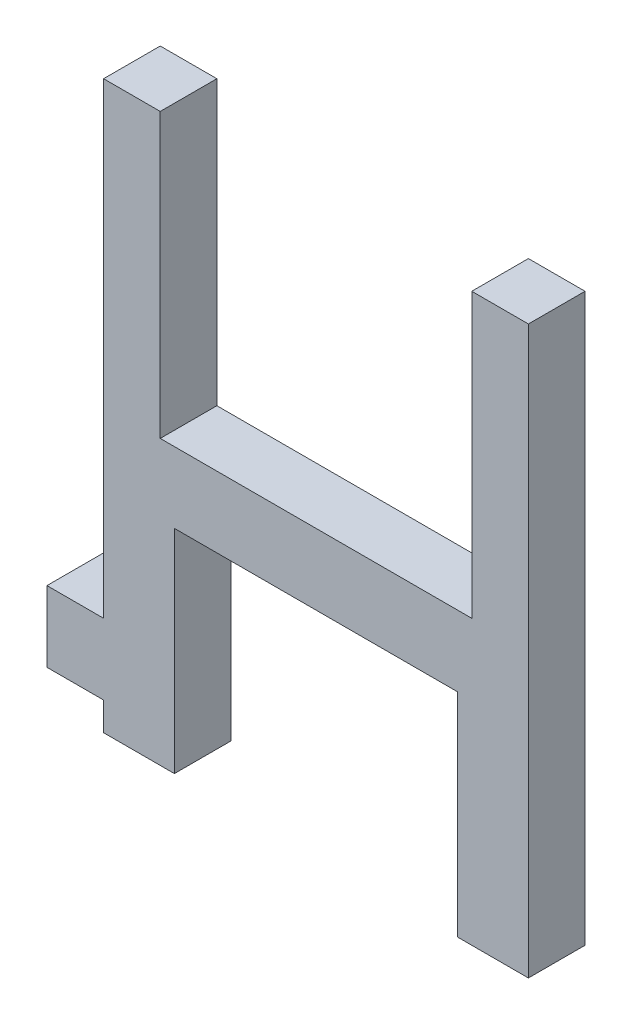
ISO-10303-21;
HEADER;
FILE_DESCRIPTION(('STEP AP214'),'2;1');
FILE_NAME('part.step','',(''),(''),'','','');
FILE_SCHEMA(('AUTOMOTIVE_DESIGN { 1 0 10303 214 1 1 1 1 }'));
ENDSEC;
DATA;
#1=APPLICATION_CONTEXT('core data for automotive mechanical design processes');
#2=APPLICATION_PROTOCOL_DEFINITION('international standard','automotive_design',2000,#1);
#3=PRODUCT_CONTEXT('',#1,'mechanical');
#4=PRODUCT('Part','Part','',(#3));
#5=PRODUCT_RELATED_PRODUCT_CATEGORY('part','',(#4));
#6=PRODUCT_DEFINITION_FORMATION('','',#4);
#7=PRODUCT_DEFINITION_CONTEXT('part definition',#1,'design');
#8=PRODUCT_DEFINITION('design','',#6,#7);
#9=PRODUCT_DEFINITION_SHAPE('','',#8);
#10=(LENGTH_UNIT() NAMED_UNIT(*) SI_UNIT(.MILLI.,.METRE.));
#11=(NAMED_UNIT(*) PLANE_ANGLE_UNIT() SI_UNIT($,.RADIAN.));
#12=(NAMED_UNIT(*) SI_UNIT($,.STERADIAN.) SOLID_ANGLE_UNIT());
#13=UNCERTAINTY_MEASURE_WITH_UNIT(LENGTH_MEASURE(1.E-05),#10,'distance_accuracy_value','');
#14=(GEOMETRIC_REPRESENTATION_CONTEXT(3) GLOBAL_UNCERTAINTY_ASSIGNED_CONTEXT((#13)) GLOBAL_UNIT_ASSIGNED_CONTEXT((#10,
#11,#12)) REPRESENTATION_CONTEXT('',''));
#15=CARTESIAN_POINT('',(0.,0.,0.));
#16=DIRECTION('',(0.,0.,1.));
#17=DIRECTION('',(1.,0.,0.));
#18=AXIS2_PLACEMENT_3D('',#15,#16,#17);
#19=CARTESIAN_POINT('',(35.,18.,4.));
#20=DIRECTION('',(0.,-1.,0.));
#21=DIRECTION('',(1.,0.,0.));
#22=AXIS2_PLACEMENT_3D('',#19,#20,#21);
#23=PLANE('',#22);
#24=DIRECTION('',(0.,0.,1.));
#25=VECTOR('',#24,1.);
#26=CARTESIAN_POINT('',(31.,18.,0.));
#27=LINE('',#26,#25);
#28=CARTESIAN_POINT('',(31.,18.,0.));
#29=VERTEX_POINT('',#28);
#30=CARTESIAN_POINT('',(31.,18.,4.));
#31=VERTEX_POINT('',#30);
#32=EDGE_CURVE('E320',#29,#31,#27,.T.);
#33=ORIENTED_EDGE('',*,*,#32,.F.);
#34=DIRECTION('',(-1.,0.,0.));
#35=VECTOR('',#34,1.);
#36=CARTESIAN_POINT('',(35.,18.,0.));
#37=LINE('',#36,#35);
#38=CARTESIAN_POINT('',(9.,18.,0.));
#39=VERTEX_POINT('',#38);
#40=EDGE_CURVE('E236',#29,#39,#37,.T.);
#41=ORIENTED_EDGE('',*,*,#40,.T.);
#42=DIRECTION('',(0.,0.,-1.));
#43=VECTOR('',#42,1.);
#44=CARTESIAN_POINT('',(9.,18.,0.));
#45=LINE('',#44,#43);
#46=CARTESIAN_POINT('',(9.,18.,4.));
#47=VERTEX_POINT('',#46);
#48=EDGE_CURVE('E336',#47,#39,#45,.T.);
#49=ORIENTED_EDGE('',*,*,#48,.F.);
#50=DIRECTION('',(-1.,0.,0.));
#51=VECTOR('',#50,1.);
#52=CARTESIAN_POINT('',(35.,18.,4.));
#53=LINE('',#52,#51);
#54=EDGE_CURVE('E62',#31,#47,#53,.T.);
#55=ORIENTED_EDGE('',*,*,#54,.F.);
#56=EDGE_LOOP('',(#33,#41,#49,#55));
#57=FACE_BOUND('',#56,.T.);
#58=ADVANCED_FACE('F39',(#57),#23,.F.);
#59=CARTESIAN_POINT('',(0.,0.,4.));
#60=DIRECTION('',(0.,1.,0.));
#61=DIRECTION('',(-1.,0.,0.));
#62=AXIS2_PLACEMENT_3D('',#59,#60,#61);
#63=PLANE('',#62);
#64=DIRECTION('',(1.,0.,0.));
#65=VECTOR('',#64,1.);
#66=CARTESIAN_POINT('',(0.,0.,4.));
#67=LINE('',#66,#65);
#68=CARTESIAN_POINT('',(1.,0.,4.));
#69=VERTEX_POINT('',#68);
#70=CARTESIAN_POINT('',(5.,0.,4.));
#71=VERTEX_POINT('',#70);
#72=EDGE_CURVE('E163',#69,#71,#67,.T.);
#73=ORIENTED_EDGE('',*,*,#72,.F.);
#74=DIRECTION('',(0.,0.,1.));
#75=VECTOR('',#74,1.);
#76=CARTESIAN_POINT('',(1.,0.,-6.));
#77=LINE('',#76,#75);
#78=CARTESIAN_POINT('',(1.,0.,0.));
#79=VERTEX_POINT('',#78);
#80=EDGE_CURVE('E151',#79,#69,#77,.T.);
#81=ORIENTED_EDGE('',*,*,#80,.F.);
#82=DIRECTION('',(1.,0.,0.));
#83=VECTOR('',#82,1.);
#84=CARTESIAN_POINT('',(0.,0.,0.));
#85=LINE('',#84,#83);
#86=CARTESIAN_POINT('',(5.,0.,0.));
#87=VERTEX_POINT('',#86);
#88=EDGE_CURVE('E211',#79,#87,#85,.T.);
#89=ORIENTED_EDGE('',*,*,#88,.T.);
#90=DIRECTION('',(0.,0.,-1.));
#91=VECTOR('',#90,1.);
#92=CARTESIAN_POINT('',(5.,0.,4.));
#93=LINE('',#92,#91);
#94=EDGE_CURVE('E48',#71,#87,#93,.T.);
#95=ORIENTED_EDGE('',*,*,#94,.F.);
#96=EDGE_LOOP('',(#73,#81,#89,#95));
#97=FACE_BOUND('',#96,.T.);
#98=ADVANCED_FACE('F41',(#97),#63,.F.);
#99=CARTESIAN_POINT('',(5.,0.,4.));
#100=DIRECTION('',(1.,0.,0.));
#101=DIRECTION('',(0.,0.,-1.));
#102=AXIS2_PLACEMENT_3D('',#99,#100,#101);
#103=PLANE('',#102);
#104=DIRECTION('',(0.,-1.,0.));
#105=VECTOR('',#104,1.);
#106=CARTESIAN_POINT('',(5.,0.,0.));
#107=LINE('',#106,#105);
#108=CARTESIAN_POINT('',(5.,-2.,0.));
#109=VERTEX_POINT('',#108);
#110=EDGE_CURVE('E214',#87,#109,#107,.T.);
#111=ORIENTED_EDGE('',*,*,#110,.T.);
#112=DIRECTION('',(0.,0.,-1.));
#113=VECTOR('',#112,1.);
#114=CARTESIAN_POINT('',(5.,-2.,4.));
#115=LINE('',#114,#113);
#116=CARTESIAN_POINT('',(5.,-2.,4.));
#117=VERTEX_POINT('',#116);
#118=EDGE_CURVE('E264',#117,#109,#115,.T.);
#119=ORIENTED_EDGE('',*,*,#118,.F.);
#120=DIRECTION('',(0.,-1.,0.));
#121=VECTOR('',#120,1.);
#122=CARTESIAN_POINT('',(5.,0.,4.));
#123=LINE('',#122,#121);
#124=EDGE_CURVE('E172',#71,#117,#123,.T.);
#125=ORIENTED_EDGE('',*,*,#124,.F.);
#126=ORIENTED_EDGE('',*,*,#94,.T.);
#127=EDGE_LOOP('',(#111,#119,#125,#126));
#128=FACE_BOUND('',#127,.T.);
#129=ADVANCED_FACE('F270',(#128),#103,.F.);
#130=CARTESIAN_POINT('',(5.,-2.,4.));
#131=DIRECTION('',(0.,1.,0.));
#132=DIRECTION('',(-1.,0.,0.));
#133=AXIS2_PLACEMENT_3D('',#130,#131,#132);
#134=PLANE('',#133);
#135=DIRECTION('',(1.,0.,0.));
#136=VECTOR('',#135,1.);
#137=CARTESIAN_POINT('',(5.,-2.,0.));
#138=LINE('',#137,#136);
#139=CARTESIAN_POINT('',(10.,-2.,0.));
#140=VERTEX_POINT('',#139);
#141=EDGE_CURVE('E217',#109,#140,#138,.T.);
#142=ORIENTED_EDGE('',*,*,#141,.T.);
#143=DIRECTION('',(0.,0.,-1.));
#144=VECTOR('',#143,1.);
#145=CARTESIAN_POINT('',(10.,-2.,4.));
#146=LINE('',#145,#144);
#147=CARTESIAN_POINT('',(10.,-2.,4.));
#148=VERTEX_POINT('',#147);
#149=EDGE_CURVE('E260',#148,#140,#146,.T.);
#150=ORIENTED_EDGE('',*,*,#149,.F.);
#151=DIRECTION('',(1.,0.,0.));
#152=VECTOR('',#151,1.);
#153=CARTESIAN_POINT('',(5.,-2.,4.));
#154=LINE('',#153,#152);
#155=EDGE_CURVE('E177',#117,#148,#154,.T.);
#156=ORIENTED_EDGE('',*,*,#155,.F.);
#157=ORIENTED_EDGE('',*,*,#118,.T.);
#158=EDGE_LOOP('',(#142,#150,#156,#157));
#159=FACE_BOUND('',#158,.T.);
#160=ADVANCED_FACE('F278',(#159),#134,.F.);
#161=CARTESIAN_POINT('',(10.,4.08247422680412,4.));
#162=DIRECTION('',(-1.,0.,0.));
#163=DIRECTION('',(0.,0.,1.));
#164=AXIS2_PLACEMENT_3D('',#161,#162,#163);
#165=PLANE('',#164);
#166=DIRECTION('',(0.,1.,0.));
#167=VECTOR('',#166,1.);
#168=CARTESIAN_POINT('',(10.,4.08247422680412,0.));
#169=LINE('',#168,#167);
#170=CARTESIAN_POINT('',(10.,13.,0.));
#171=VERTEX_POINT('',#170);
#172=EDGE_CURVE('E221',#140,#171,#169,.T.);
#173=ORIENTED_EDGE('',*,*,#172,.T.);
#174=DIRECTION('',(0.,0.,-1.));
#175=VECTOR('',#174,1.);
#176=CARTESIAN_POINT('',(10.,13.,4.));
#177=LINE('',#176,#175);
#178=CARTESIAN_POINT('',(10.,13.,4.));
#179=VERTEX_POINT('',#178);
#180=EDGE_CURVE('E256',#179,#171,#177,.T.);
#181=ORIENTED_EDGE('',*,*,#180,.F.);
#182=DIRECTION('',(0.,1.,0.));
#183=VECTOR('',#182,1.);
#184=CARTESIAN_POINT('',(10.,-2.,4.));
#185=LINE('',#184,#183);
#186=EDGE_CURVE('E188',#148,#179,#185,.T.);
#187=ORIENTED_EDGE('',*,*,#186,.F.);
#188=ORIENTED_EDGE('',*,*,#149,.T.);
#189=EDGE_LOOP('',(#173,#181,#187,#188));
#190=FACE_BOUND('',#189,.T.);
#191=ADVANCED_FACE('F282',(#190),#165,.F.);
#192=CARTESIAN_POINT('',(10.,13.,4.));
#193=DIRECTION('',(0.,1.,0.));
#194=DIRECTION('',(-1.,0.,0.));
#195=AXIS2_PLACEMENT_3D('',#192,#193,#194);
#196=PLANE('',#195);
#197=DIRECTION('',(1.,0.,0.));
#198=VECTOR('',#197,1.);
#199=CARTESIAN_POINT('',(10.,13.,0.));
#200=LINE('',#199,#198);
#201=CARTESIAN_POINT('',(30.,13.,0.));
#202=VERTEX_POINT('',#201);
#203=EDGE_CURVE('E224',#171,#202,#200,.T.);
#204=ORIENTED_EDGE('',*,*,#203,.T.);
#205=DIRECTION('',(0.,0.,-1.));
#206=VECTOR('',#205,1.);
#207=CARTESIAN_POINT('',(30.,13.,4.));
#208=LINE('',#207,#206);
#209=CARTESIAN_POINT('',(30.,13.,4.));
#210=VERTEX_POINT('',#209);
#211=EDGE_CURVE('E252',#210,#202,#208,.T.);
#212=ORIENTED_EDGE('',*,*,#211,.F.);
#213=DIRECTION('',(1.,0.,0.));
#214=VECTOR('',#213,1.);
#215=CARTESIAN_POINT('',(10.,13.,4.));
#216=LINE('',#215,#214);
#217=EDGE_CURVE('E191',#179,#210,#216,.T.);
#218=ORIENTED_EDGE('',*,*,#217,.F.);
#219=ORIENTED_EDGE('',*,*,#180,.T.);
#220=EDGE_LOOP('',(#204,#212,#218,#219));
#221=FACE_BOUND('',#220,.T.);
#222=ADVANCED_FACE('F289',(#221),#196,.F.);
#223=CARTESIAN_POINT('',(30.,13.,4.));
#224=DIRECTION('',(1.,0.,0.));
#225=DIRECTION('',(0.,0.,-1.));
#226=AXIS2_PLACEMENT_3D('',#223,#224,#225);
#227=PLANE('',#226);
#228=DIRECTION('',(0.,-1.,0.));
#229=VECTOR('',#228,1.);
#230=CARTESIAN_POINT('',(30.,13.,0.));
#231=LINE('',#230,#229);
#232=CARTESIAN_POINT('',(30.,-2.,0.));
#233=VERTEX_POINT('',#232);
#234=EDGE_CURVE('E227',#202,#233,#231,.T.);
#235=ORIENTED_EDGE('',*,*,#234,.T.);
#236=DIRECTION('',(0.,0.,-1.));
#237=VECTOR('',#236,1.);
#238=CARTESIAN_POINT('',(30.,-2.,4.));
#239=LINE('',#238,#237);
#240=CARTESIAN_POINT('',(30.,-2.,4.));
#241=VERTEX_POINT('',#240);
#242=EDGE_CURVE('E248',#241,#233,#239,.T.);
#243=ORIENTED_EDGE('',*,*,#242,.F.);
#244=DIRECTION('',(0.,-1.,0.));
#245=VECTOR('',#244,1.);
#246=CARTESIAN_POINT('',(30.,13.,4.));
#247=LINE('',#246,#245);
#248=EDGE_CURVE('E194',#210,#241,#247,.T.);
#249=ORIENTED_EDGE('',*,*,#248,.F.);
#250=ORIENTED_EDGE('',*,*,#211,.T.);
#251=EDGE_LOOP('',(#235,#243,#249,#250));
#252=FACE_BOUND('',#251,.T.);
#253=ADVANCED_FACE('F292',(#252),#227,.F.);
#254=CARTESIAN_POINT('',(30.,-2.,4.));
#255=DIRECTION('',(0.,1.,0.));
#256=DIRECTION('',(0.,0.,1.));
#257=AXIS2_PLACEMENT_3D('',#254,#255,#256);
#258=PLANE('',#257);
#259=DIRECTION('',(1.,0.,0.));
#260=VECTOR('',#259,1.);
#261=CARTESIAN_POINT('',(30.,-2.,0.));
#262=LINE('',#261,#260);
#263=CARTESIAN_POINT('',(35.,-2.,0.));
#264=VERTEX_POINT('',#263);
#265=EDGE_CURVE('E230',#233,#264,#262,.T.);
#266=ORIENTED_EDGE('',*,*,#265,.T.);
#267=DIRECTION('',(0.,0.,-1.));
#268=VECTOR('',#267,1.);
#269=CARTESIAN_POINT('',(35.,-2.,4.));
#270=LINE('',#269,#268);
#271=CARTESIAN_POINT('',(35.,-2.,4.));
#272=VERTEX_POINT('',#271);
#273=EDGE_CURVE('E244',#272,#264,#270,.T.);
#274=ORIENTED_EDGE('',*,*,#273,.F.);
#275=DIRECTION('',(1.,0.,0.));
#276=VECTOR('',#275,1.);
#277=CARTESIAN_POINT('',(30.,-2.,4.));
#278=LINE('',#277,#276);
#279=EDGE_CURVE('E197',#241,#272,#278,.T.);
#280=ORIENTED_EDGE('',*,*,#279,.F.);
#281=ORIENTED_EDGE('',*,*,#242,.T.);
#282=EDGE_LOOP('',(#266,#274,#280,#281));
#283=FACE_BOUND('',#282,.T.);
#284=ADVANCED_FACE('F297',(#283),#258,.F.);
#285=CARTESIAN_POINT('',(35.,-2.,4.));
#286=DIRECTION('',(-1.,0.,0.));
#287=DIRECTION('',(0.,0.,1.));
#288=AXIS2_PLACEMENT_3D('',#285,#286,#287);
#289=PLANE('',#288);
#290=DIRECTION('',(0.,1.,0.));
#291=VECTOR('',#290,1.);
#292=CARTESIAN_POINT('',(35.,-2.,0.));
#293=LINE('',#292,#291);
#294=CARTESIAN_POINT('',(35.,38.,0.));
#295=VERTEX_POINT('',#294);
#296=EDGE_CURVE('E233',#264,#295,#293,.T.);
#297=ORIENTED_EDGE('',*,*,#296,.T.);
#298=DIRECTION('',(0.,0.,-1.));
#299=VECTOR('',#298,1.);
#300=CARTESIAN_POINT('',(35.,38.,0.));
#301=LINE('',#300,#299);
#302=CARTESIAN_POINT('',(35.,38.,4.));
#303=VERTEX_POINT('',#302);
#304=EDGE_CURVE('E308',#303,#295,#301,.T.);
#305=ORIENTED_EDGE('',*,*,#304,.F.);
#306=DIRECTION('',(0.,1.,0.));
#307=VECTOR('',#306,1.);
#308=CARTESIAN_POINT('',(35.,-2.,4.));
#309=LINE('',#308,#307);
#310=EDGE_CURVE('E200',#272,#303,#309,.T.);
#311=ORIENTED_EDGE('',*,*,#310,.F.);
#312=ORIENTED_EDGE('',*,*,#273,.T.);
#313=EDGE_LOOP('',(#297,#305,#311,#312));
#314=FACE_BOUND('',#313,.T.);
#315=ADVANCED_FACE('F315',(#314),#289,.F.);
#316=CARTESIAN_POINT('',(5.,18.,4.));
#317=DIRECTION('',(1.,0.,0.));
#318=DIRECTION('',(0.,1.,0.));
#319=AXIS2_PLACEMENT_3D('',#316,#317,#318);
#320=PLANE('',#319);
#321=DIRECTION('',(0.,-1.,0.));
#322=VECTOR('',#321,1.);
#323=CARTESIAN_POINT('',(5.,18.,0.));
#324=LINE('',#323,#322);
#325=CARTESIAN_POINT('',(4.99999999999999,38.,0.));
#326=VERTEX_POINT('',#325);
#327=CARTESIAN_POINT('',(5.,5.,0.));
#328=VERTEX_POINT('',#327);
#329=EDGE_CURVE('E180',#326,#328,#324,.T.);
#330=ORIENTED_EDGE('',*,*,#329,.T.);
#331=DIRECTION('',(0.,0.,-1.));
#332=VECTOR('',#331,1.);
#333=CARTESIAN_POINT('',(5.,5.,4.));
#334=LINE('',#333,#332);
#335=CARTESIAN_POINT('',(5.,5.,4.));
#336=VERTEX_POINT('',#335);
#337=EDGE_CURVE('E210',#336,#328,#334,.T.);
#338=ORIENTED_EDGE('',*,*,#337,.F.);
#339=DIRECTION('',(0.,-1.,0.));
#340=VECTOR('',#339,1.);
#341=CARTESIAN_POINT('',(5.,18.,4.));
#342=LINE('',#341,#340);
#343=CARTESIAN_POINT('',(5.,38.,4.));
#344=VERTEX_POINT('',#343);
#345=EDGE_CURVE('E205',#344,#336,#342,.T.);
#346=ORIENTED_EDGE('',*,*,#345,.F.);
#347=DIRECTION('',(0.,0.,1.));
#348=VECTOR('',#347,1.);
#349=CARTESIAN_POINT('',(4.99999999999999,38.,0.));
#350=LINE('',#349,#348);
#351=EDGE_CURVE('E337',#326,#344,#350,.T.);
#352=ORIENTED_EDGE('',*,*,#351,.F.);
#353=EDGE_LOOP('',(#330,#338,#346,#352));
#354=FACE_BOUND('',#353,.T.);
#355=ADVANCED_FACE('F386',(#354),#320,.F.);
#356=CARTESIAN_POINT('',(5.,5.,4.));
#357=DIRECTION('',(0.,-1.,0.));
#358=DIRECTION('',(0.,0.,-1.));
#359=AXIS2_PLACEMENT_3D('',#356,#357,#358);
#360=PLANE('',#359);
#361=DIRECTION('',(-1.,0.,0.));
#362=VECTOR('',#361,1.);
#363=CARTESIAN_POINT('',(5.,5.,0.));
#364=LINE('',#363,#362);
#365=CARTESIAN_POINT('',(1.,5.,0.));
#366=VERTEX_POINT('',#365);
#367=EDGE_CURVE('E173',#328,#366,#364,.T.);
#368=ORIENTED_EDGE('',*,*,#367,.T.);
#369=DIRECTION('',(0.,0.,1.));
#370=VECTOR('',#369,1.);
#371=CARTESIAN_POINT('',(1.,5.,-6.));
#372=LINE('',#371,#370);
#373=CARTESIAN_POINT('',(1.,5.,4.));
#374=VERTEX_POINT('',#373);
#375=EDGE_CURVE('E55',#366,#374,#372,.T.);
#376=ORIENTED_EDGE('',*,*,#375,.T.);
#377=DIRECTION('',(-1.,0.,0.));
#378=VECTOR('',#377,1.);
#379=CARTESIAN_POINT('',(5.,5.,4.));
#380=LINE('',#379,#378);
#381=EDGE_CURVE('E166',#336,#374,#380,.T.);
#382=ORIENTED_EDGE('',*,*,#381,.F.);
#383=ORIENTED_EDGE('',*,*,#337,.T.);
#384=EDGE_LOOP('',(#368,#376,#382,#383));
#385=FACE_BOUND('',#384,.T.);
#386=ADVANCED_FACE('F434',(#385),#360,.F.);
#387=CARTESIAN_POINT('',(0.,0.,4.));
#388=DIRECTION('',(0.,0.,1.));
#389=DIRECTION('',(1.,0.,0.));
#390=AXIS2_PLACEMENT_3D('',#387,#388,#389);
#391=PLANE('',#390);
#392=DIRECTION('',(0.,1.,0.));
#393=VECTOR('',#392,1.);
#394=CARTESIAN_POINT('',(1.,5.,4.));
#395=LINE('',#394,#393);
#396=EDGE_CURVE('E154',#69,#374,#395,.T.);
#397=ORIENTED_EDGE('',*,*,#396,.F.);
#398=ORIENTED_EDGE('',*,*,#72,.T.);
#399=ORIENTED_EDGE('',*,*,#124,.T.);
#400=ORIENTED_EDGE('',*,*,#155,.T.);
#401=ORIENTED_EDGE('',*,*,#186,.T.);
#402=ORIENTED_EDGE('',*,*,#217,.T.);
#403=ORIENTED_EDGE('',*,*,#248,.T.);
#404=ORIENTED_EDGE('',*,*,#279,.T.);
#405=ORIENTED_EDGE('',*,*,#310,.T.);
#406=DIRECTION('',(1.,0.,0.));
#407=VECTOR('',#406,1.);
#408=CARTESIAN_POINT('',(35.,38.,4.));
#409=LINE('',#408,#407);
#410=CARTESIAN_POINT('',(31.,38.,4.));
#411=VERTEX_POINT('',#410);
#412=EDGE_CURVE('E302',#411,#303,#409,.T.);
#413=ORIENTED_EDGE('',*,*,#412,.F.);
#414=DIRECTION('',(0.,-1.,0.));
#415=VECTOR('',#414,1.);
#416=CARTESIAN_POINT('',(31.,38.,4.));
#417=LINE('',#416,#415);
#418=EDGE_CURVE('E313',#411,#31,#417,.T.);
#419=ORIENTED_EDGE('',*,*,#418,.T.);
#420=ORIENTED_EDGE('',*,*,#54,.T.);
#421=DIRECTION('',(0.,-1.,0.));
#422=VECTOR('',#421,1.);
#423=CARTESIAN_POINT('',(9.,38.,4.));
#424=LINE('',#423,#422);
#425=CARTESIAN_POINT('',(9.,38.,4.));
#426=VERTEX_POINT('',#425);
#427=EDGE_CURVE('E183',#426,#47,#424,.T.);
#428=ORIENTED_EDGE('',*,*,#427,.F.);
#429=DIRECTION('',(1.,0.,0.));
#430=VECTOR('',#429,1.);
#431=CARTESIAN_POINT('',(5.,38.,4.));
#432=LINE('',#431,#430);
#433=EDGE_CURVE('E341',#344,#426,#432,.T.);
#434=ORIENTED_EDGE('',*,*,#433,.F.);
#435=ORIENTED_EDGE('',*,*,#345,.T.);
#436=ORIENTED_EDGE('',*,*,#381,.T.);
#437=EDGE_LOOP('',(#397,#398,#399,#400,#401,#402,#403,#404,#405,#413,#419,#420,#428,#434,#435,#436));
#438=FACE_BOUND('',#437,.T.);
#439=ADVANCED_FACE('F162',(#438),#391,.T.);
#440=CARTESIAN_POINT('',(0.,0.,0.));
#441=DIRECTION('',(0.,0.,1.));
#442=DIRECTION('',(1.,0.,0.));
#443=AXIS2_PLACEMENT_3D('',#440,#441,#442);
#444=PLANE('',#443);
#445=ORIENTED_EDGE('',*,*,#88,.F.);
#446=DIRECTION('',(0.,1.,0.));
#447=VECTOR('',#446,1.);
#448=CARTESIAN_POINT('',(1.,0.,0.));
#449=LINE('',#448,#447);
#450=EDGE_CURVE('E11',#79,#366,#449,.T.);
#451=ORIENTED_EDGE('',*,*,#450,.T.);
#452=ORIENTED_EDGE('',*,*,#367,.F.);
#453=ORIENTED_EDGE('',*,*,#329,.F.);
#454=DIRECTION('',(-1.,0.,0.));
#455=VECTOR('',#454,1.);
#456=CARTESIAN_POINT('',(4.99999999999999,38.,0.));
#457=LINE('',#456,#455);
#458=CARTESIAN_POINT('',(9.,38.,0.));
#459=VERTEX_POINT('',#458);
#460=EDGE_CURVE('E347',#459,#326,#457,.T.);
#461=ORIENTED_EDGE('',*,*,#460,.F.);
#462=DIRECTION('',(0.,-1.,0.));
#463=VECTOR('',#462,1.);
#464=CARTESIAN_POINT('',(9.,38.,0.));
#465=LINE('',#464,#463);
#466=EDGE_CURVE('E351',#459,#39,#465,.T.);
#467=ORIENTED_EDGE('',*,*,#466,.T.);
#468=ORIENTED_EDGE('',*,*,#40,.F.);
#469=DIRECTION('',(0.,-1.,0.));
#470=VECTOR('',#469,1.);
#471=CARTESIAN_POINT('',(31.,38.,0.));
#472=LINE('',#471,#470);
#473=CARTESIAN_POINT('',(31.,38.,0.));
#474=VERTEX_POINT('',#473);
#475=EDGE_CURVE('E332',#474,#29,#472,.T.);
#476=ORIENTED_EDGE('',*,*,#475,.F.);
#477=DIRECTION('',(-1.,0.,0.));
#478=VECTOR('',#477,1.);
#479=CARTESIAN_POINT('',(35.,38.,0.));
#480=LINE('',#479,#478);
#481=EDGE_CURVE('E319',#295,#474,#480,.T.);
#482=ORIENTED_EDGE('',*,*,#481,.F.);
#483=ORIENTED_EDGE('',*,*,#296,.F.);
#484=ORIENTED_EDGE('',*,*,#265,.F.);
#485=ORIENTED_EDGE('',*,*,#234,.F.);
#486=ORIENTED_EDGE('',*,*,#203,.F.);
#487=ORIENTED_EDGE('',*,*,#172,.F.);
#488=ORIENTED_EDGE('',*,*,#141,.F.);
#489=ORIENTED_EDGE('',*,*,#110,.F.);
#490=EDGE_LOOP('',(#445,#451,#452,#453,#461,#467,#468,#476,#482,#483,#484,#485,#486,#487,#488,#489));
#491=FACE_BOUND('',#490,.T.);
#492=ADVANCED_FACE('F274',(#491),#444,.F.);
#493=CARTESIAN_POINT('',(9.,38.,0.));
#494=DIRECTION('',(-1.,0.,0.));
#495=DIRECTION('',(0.,0.,1.));
#496=AXIS2_PLACEMENT_3D('',#493,#494,#495);
#497=PLANE('',#496);
#498=ORIENTED_EDGE('',*,*,#48,.T.);
#499=ORIENTED_EDGE('',*,*,#466,.F.);
#500=DIRECTION('',(0.,0.,-1.));
#501=VECTOR('',#500,1.);
#502=CARTESIAN_POINT('',(9.,38.,0.));
#503=LINE('',#502,#501);
#504=EDGE_CURVE('E344',#426,#459,#503,.T.);
#505=ORIENTED_EDGE('',*,*,#504,.F.);
#506=ORIENTED_EDGE('',*,*,#427,.T.);
#507=EDGE_LOOP('',(#498,#499,#505,#506));
#508=FACE_BOUND('',#507,.T.);
#509=ADVANCED_FACE('F363',(#508),#497,.F.);
#510=CARTESIAN_POINT('',(0.,38.,0.));
#511=DIRECTION('',(0.,1.,0.));
#512=DIRECTION('',(0.,0.,1.));
#513=AXIS2_PLACEMENT_3D('',#510,#511,#512);
#514=PLANE('',#513);
#515=ORIENTED_EDGE('',*,*,#351,.T.);
#516=ORIENTED_EDGE('',*,*,#433,.T.);
#517=ORIENTED_EDGE('',*,*,#504,.T.);
#518=ORIENTED_EDGE('',*,*,#460,.T.);
#519=EDGE_LOOP('',(#515,#516,#517,#518));
#520=FACE_BOUND('',#519,.T.);
#521=ADVANCED_FACE('F369',(#520),#514,.T.);
#522=CARTESIAN_POINT('',(31.,38.,0.));
#523=DIRECTION('',(1.,0.,0.));
#524=DIRECTION('',(0.,1.,0.));
#525=AXIS2_PLACEMENT_3D('',#522,#523,#524);
#526=PLANE('',#525);
#527=ORIENTED_EDGE('',*,*,#32,.T.);
#528=ORIENTED_EDGE('',*,*,#418,.F.);
#529=DIRECTION('',(0.,0.,1.));
#530=VECTOR('',#529,1.);
#531=CARTESIAN_POINT('',(31.,38.,0.));
#532=LINE('',#531,#530);
#533=EDGE_CURVE('E310',#474,#411,#532,.T.);
#534=ORIENTED_EDGE('',*,*,#533,.F.);
#535=ORIENTED_EDGE('',*,*,#475,.T.);
#536=EDGE_LOOP('',(#527,#528,#534,#535));
#537=FACE_BOUND('',#536,.T.);
#538=ADVANCED_FACE('F367',(#537),#526,.F.);
#539=CARTESIAN_POINT('',(0.,38.,0.));
#540=DIRECTION('',(0.,-1.,0.));
#541=DIRECTION('',(0.,0.,-1.));
#542=AXIS2_PLACEMENT_3D('',#539,#540,#541);
#543=PLANE('',#542);
#544=ORIENTED_EDGE('',*,*,#304,.T.);
#545=ORIENTED_EDGE('',*,*,#481,.T.);
#546=ORIENTED_EDGE('',*,*,#533,.T.);
#547=ORIENTED_EDGE('',*,*,#412,.T.);
#548=EDGE_LOOP('',(#544,#545,#546,#547));
#549=FACE_BOUND('',#548,.T.);
#550=ADVANCED_FACE('F307',(#549),#543,.F.);
#551=CARTESIAN_POINT('',(1.,5.,-6.));
#552=DIRECTION('',(1.,0.,0.));
#553=DIRECTION('',(0.,1.,0.));
#554=AXIS2_PLACEMENT_3D('',#551,#552,#553);
#555=PLANE('',#554);
#556=ORIENTED_EDGE('',*,*,#80,.T.);
#557=ORIENTED_EDGE('',*,*,#396,.T.);
#558=ORIENTED_EDGE('',*,*,#375,.F.);
#559=ORIENTED_EDGE('',*,*,#450,.F.);
#560=EDGE_LOOP('',(#556,#557,#558,#559));
#561=FACE_BOUND('',#560,.T.);
#562=ADVANCED_FACE('F153',(#561),#555,.F.);
#563=CLOSED_SHELL('',(#58,#98,#129,#160,#191,#222,#253,#284,#315,#355,#386,#439,#492,#509,#521,
#538,#550,#562));
#564=MANIFOLD_SOLID_BREP('B2',#563);
#565=ADVANCED_BREP_SHAPE_REPRESENTATION('',(#18,#564),#14);
#566=SHAPE_DEFINITION_REPRESENTATION(#9,#565);
ENDSEC;
END-ISO-10303-21;
